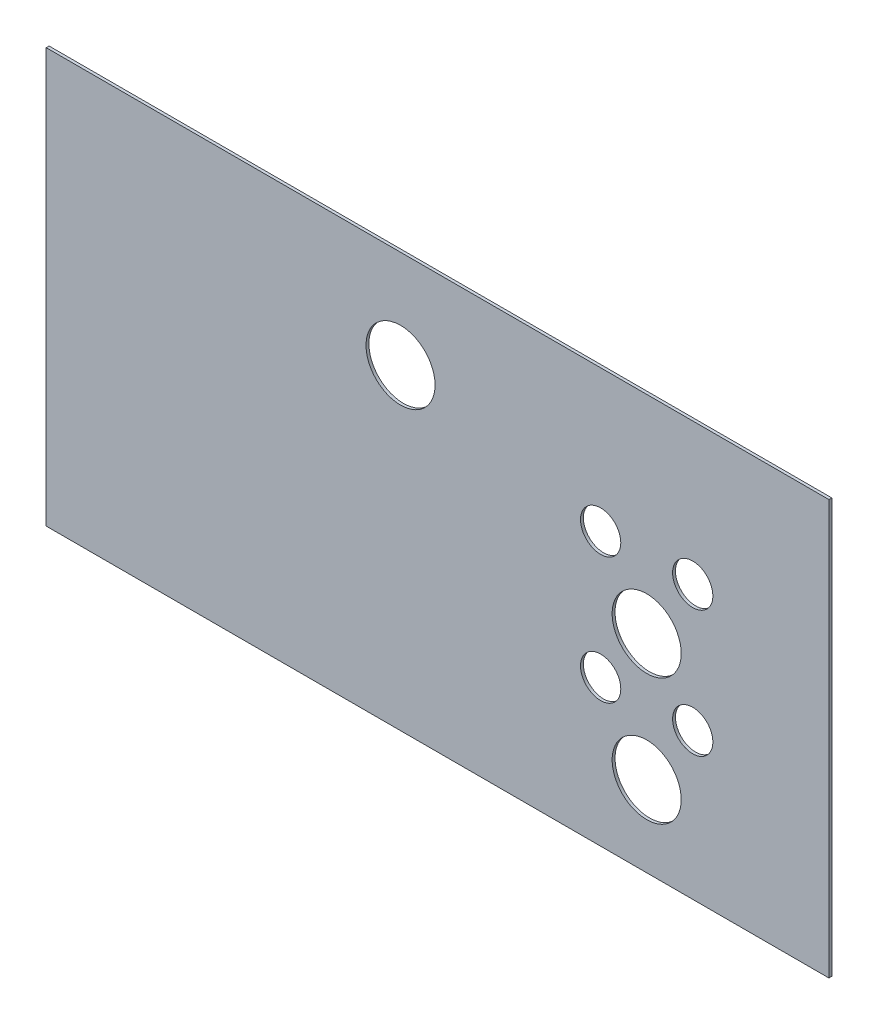
ISO-10303-21;
HEADER;
FILE_DESCRIPTION(('STEP AP214'),'2;1');
FILE_NAME('part.step','',(''),(''),'','','');
FILE_SCHEMA(('AUTOMOTIVE_DESIGN { 1 0 10303 214 1 1 1 1 }'));
ENDSEC;
DATA;
#1=APPLICATION_CONTEXT('core data for automotive mechanical design processes');
#2=APPLICATION_PROTOCOL_DEFINITION('international standard','automotive_design',2000,#1);
#3=PRODUCT_CONTEXT('',#1,'mechanical');
#4=PRODUCT('Part','Part','',(#3));
#5=PRODUCT_RELATED_PRODUCT_CATEGORY('part','',(#4));
#6=PRODUCT_DEFINITION_FORMATION('','',#4);
#7=PRODUCT_DEFINITION_CONTEXT('part definition',#1,'design');
#8=PRODUCT_DEFINITION('design','',#6,#7);
#9=PRODUCT_DEFINITION_SHAPE('','',#8);
#10=(LENGTH_UNIT() NAMED_UNIT(*) SI_UNIT(.MILLI.,.METRE.));
#11=(NAMED_UNIT(*) PLANE_ANGLE_UNIT() SI_UNIT($,.RADIAN.));
#12=(NAMED_UNIT(*) SI_UNIT($,.STERADIAN.) SOLID_ANGLE_UNIT());
#13=UNCERTAINTY_MEASURE_WITH_UNIT(LENGTH_MEASURE(1.E-05),#10,'distance_accuracy_value','');
#14=(GEOMETRIC_REPRESENTATION_CONTEXT(3) GLOBAL_UNCERTAINTY_ASSIGNED_CONTEXT((#13)) GLOBAL_UNIT_ASSIGNED_CONTEXT((#10,
#11,#12)) REPRESENTATION_CONTEXT('',''));
#15=CARTESIAN_POINT('',(0.,0.,0.));
#16=DIRECTION('',(0.,0.,1.));
#17=DIRECTION('',(1.,0.,0.));
#18=AXIS2_PLACEMENT_3D('',#15,#16,#17);
#19=CARTESIAN_POINT('',(-431.8,228.6,3.175));
#20=DIRECTION('',(1.,0.,0.));
#21=DIRECTION('',(0.,0.,-1.));
#22=AXIS2_PLACEMENT_3D('',#19,#20,#21);
#23=PLANE('',#22);
#24=DIRECTION('',(0.,-1.,0.));
#25=VECTOR('',#24,1.);
#26=CARTESIAN_POINT('',(-431.8,228.6,0.));
#27=LINE('',#26,#25);
#28=CARTESIAN_POINT('',(-431.8,228.6,0.));
#29=VERTEX_POINT('',#28);
#30=CARTESIAN_POINT('',(-431.8,-228.6,0.));
#31=VERTEX_POINT('',#30);
#32=EDGE_CURVE('E95',#29,#31,#27,.T.);
#33=ORIENTED_EDGE('',*,*,#32,.T.);
#34=DIRECTION('',(0.,0.,-1.));
#35=VECTOR('',#34,1.);
#36=CARTESIAN_POINT('',(-431.8,-228.6,3.175));
#37=LINE('',#36,#35);
#38=CARTESIAN_POINT('',(-431.8,-228.6,3.175));
#39=VERTEX_POINT('',#38);
#40=EDGE_CURVE('E11',#39,#31,#37,.T.);
#41=ORIENTED_EDGE('',*,*,#40,.F.);
#42=DIRECTION('',(0.,-1.,0.));
#43=VECTOR('',#42,1.);
#44=CARTESIAN_POINT('',(-431.8,228.6,3.175));
#45=LINE('',#44,#43);
#46=CARTESIAN_POINT('',(-431.8,228.6,3.175));
#47=VERTEX_POINT('',#46);
#48=EDGE_CURVE('E83',#47,#39,#45,.T.);
#49=ORIENTED_EDGE('',*,*,#48,.F.);
#50=DIRECTION('',(0.,0.,-1.));
#51=VECTOR('',#50,1.);
#52=CARTESIAN_POINT('',(-431.8,228.6,3.175));
#53=LINE('',#52,#51);
#54=EDGE_CURVE('E91',#47,#29,#53,.T.);
#55=ORIENTED_EDGE('',*,*,#54,.T.);
#56=EDGE_LOOP('',(#33,#41,#49,#55));
#57=FACE_BOUND('',#56,.T.);
#58=ADVANCED_FACE('F32',(#57),#23,.F.);
#59=CARTESIAN_POINT('',(-431.8,-228.6,3.175));
#60=DIRECTION('',(0.,1.,0.));
#61=DIRECTION('',(0.,0.,1.));
#62=AXIS2_PLACEMENT_3D('',#59,#60,#61);
#63=PLANE('',#62);
#64=DIRECTION('',(1.,0.,0.));
#65=VECTOR('',#64,1.);
#66=CARTESIAN_POINT('',(-431.8,-228.6,0.));
#67=LINE('',#66,#65);
#68=CARTESIAN_POINT('',(431.8,-228.6,0.));
#69=VERTEX_POINT('',#68);
#70=EDGE_CURVE('E87',#31,#69,#67,.T.);
#71=ORIENTED_EDGE('',*,*,#70,.T.);
#72=DIRECTION('',(0.,0.,-1.));
#73=VECTOR('',#72,1.);
#74=CARTESIAN_POINT('',(431.8,-228.6,3.175));
#75=LINE('',#74,#73);
#76=CARTESIAN_POINT('',(431.8,-228.6,3.175));
#77=VERTEX_POINT('',#76);
#78=EDGE_CURVE('E40',#77,#69,#75,.T.);
#79=ORIENTED_EDGE('',*,*,#78,.F.);
#80=DIRECTION('',(1.,0.,0.));
#81=VECTOR('',#80,1.);
#82=CARTESIAN_POINT('',(-431.8,-228.6,3.175));
#83=LINE('',#82,#81);
#84=EDGE_CURVE('E78',#39,#77,#83,.T.);
#85=ORIENTED_EDGE('',*,*,#84,.F.);
#86=ORIENTED_EDGE('',*,*,#40,.T.);
#87=EDGE_LOOP('',(#71,#79,#85,#86));
#88=FACE_BOUND('',#87,.T.);
#89=ADVANCED_FACE('F86',(#88),#63,.F.);
#90=CARTESIAN_POINT('',(431.8,228.6,3.175));
#91=DIRECTION('',(-1.,0.,0.));
#92=DIRECTION('',(0.,0.,1.));
#93=AXIS2_PLACEMENT_3D('',#90,#91,#92);
#94=PLANE('',#93);
#95=DIRECTION('',(0.,1.,0.));
#96=VECTOR('',#95,1.);
#97=CARTESIAN_POINT('',(431.8,228.6,0.));
#98=LINE('',#97,#96);
#99=CARTESIAN_POINT('',(431.8,228.6,0.));
#100=VERTEX_POINT('',#99);
#101=EDGE_CURVE('E65',#69,#100,#98,.T.);
#102=ORIENTED_EDGE('',*,*,#101,.T.);
#103=DIRECTION('',(0.,0.,-1.));
#104=VECTOR('',#103,1.);
#105=CARTESIAN_POINT('',(431.8,228.6,3.175));
#106=LINE('',#105,#104);
#107=CARTESIAN_POINT('',(431.8,228.6,3.175));
#108=VERTEX_POINT('',#107);
#109=EDGE_CURVE('E88',#108,#100,#106,.T.);
#110=ORIENTED_EDGE('',*,*,#109,.F.);
#111=DIRECTION('',(0.,1.,0.));
#112=VECTOR('',#111,1.);
#113=CARTESIAN_POINT('',(431.8,228.6,3.175));
#114=LINE('',#113,#112);
#115=EDGE_CURVE('E81',#77,#108,#114,.T.);
#116=ORIENTED_EDGE('',*,*,#115,.F.);
#117=ORIENTED_EDGE('',*,*,#78,.T.);
#118=EDGE_LOOP('',(#102,#110,#116,#117));
#119=FACE_BOUND('',#118,.T.);
#120=ADVANCED_FACE('F89',(#119),#94,.F.);
#121=CARTESIAN_POINT('',(-431.8,228.6,3.175));
#122=DIRECTION('',(0.,-1.,0.));
#123=DIRECTION('',(0.,0.,-1.));
#124=AXIS2_PLACEMENT_3D('',#121,#122,#123);
#125=PLANE('',#124);
#126=DIRECTION('',(-1.,0.,0.));
#127=VECTOR('',#126,1.);
#128=CARTESIAN_POINT('',(-431.8,228.6,0.));
#129=LINE('',#128,#127);
#130=EDGE_CURVE('E71',#100,#29,#129,.T.);
#131=ORIENTED_EDGE('',*,*,#130,.T.);
#132=ORIENTED_EDGE('',*,*,#54,.F.);
#133=DIRECTION('',(-1.,0.,0.));
#134=VECTOR('',#133,1.);
#135=CARTESIAN_POINT('',(-431.8,228.6,3.175));
#136=LINE('',#135,#134);
#137=EDGE_CURVE('E48',#108,#47,#136,.T.);
#138=ORIENTED_EDGE('',*,*,#137,.F.);
#139=ORIENTED_EDGE('',*,*,#109,.T.);
#140=EDGE_LOOP('',(#131,#132,#138,#139));
#141=FACE_BOUND('',#140,.T.);
#142=ADVANCED_FACE('F103',(#141),#125,.F.);
#143=CARTESIAN_POINT('',(0.,0.,3.175));
#144=DIRECTION('',(0.,0.,1.));
#145=DIRECTION('',(1.,0.,0.));
#146=AXIS2_PLACEMENT_3D('',#143,#144,#145);
#147=PLANE('',#146);
#148=CARTESIAN_POINT('',(230.7381000037,-139.7,3.175));
#149=DIRECTION('',(0.,0.,1.));
#150=DIRECTION('',(1.,0.,0.));
#151=AXIS2_PLACEMENT_3D('',#148,#149,#150);
#152=CIRCLE('',#151,38.1);
#153=CARTESIAN_POINT('',(268.8381000037,-139.7,3.175));
#154=VERTEX_POINT('',#153);
#155=EDGE_CURVE('E122',#154,#154,#152,.T.);
#156=ORIENTED_EDGE('',*,*,#155,.F.);
#157=EDGE_LOOP('',(#156));
#158=FACE_BOUND('',#157,.T.);
#159=CARTESIAN_POINT('',(-40.8558999878,120.65,3.175));
#160=DIRECTION('',(0.,0.,1.));
#161=DIRECTION('',(1.,0.,0.));
#162=AXIS2_PLACEMENT_3D('',#159,#160,#161);
#163=CIRCLE('',#162,38.1);
#164=CARTESIAN_POINT('',(-2.75589998779996,120.65,3.175));
#165=VERTEX_POINT('',#164);
#166=EDGE_CURVE('E135',#165,#165,#163,.T.);
#167=ORIENTED_EDGE('',*,*,#166,.F.);
#168=EDGE_LOOP('',(#167));
#169=FACE_BOUND('',#168,.T.);
#170=CARTESIAN_POINT('',(281.5381000037,72.4772000034,3.175));
#171=DIRECTION('',(0.,0.,1.));
#172=DIRECTION('',(1.,0.,0.));
#173=AXIS2_PLACEMENT_3D('',#170,#171,#172);
#174=CIRCLE('',#173,22.225);
#175=CARTESIAN_POINT('',(303.7631000037,72.4772000034,3.175));
#176=VERTEX_POINT('',#175);
#177=EDGE_CURVE('E141',#176,#176,#174,.T.);
#178=ORIENTED_EDGE('',*,*,#177,.F.);
#179=EDGE_LOOP('',(#178));
#180=FACE_BOUND('',#179,.T.);
#181=CARTESIAN_POINT('',(179.9381000037,-67.2227999966,3.175));
#182=DIRECTION('',(0.,0.,1.));
#183=DIRECTION('',(1.,0.,0.));
#184=AXIS2_PLACEMENT_3D('',#181,#182,#183);
#185=CIRCLE('',#184,22.225);
#186=CARTESIAN_POINT('',(202.1631000037,-67.2227999966,3.175));
#187=VERTEX_POINT('',#186);
#188=EDGE_CURVE('E116',#187,#187,#185,.T.);
#189=ORIENTED_EDGE('',*,*,#188,.F.);
#190=EDGE_LOOP('',(#189));
#191=FACE_BOUND('',#190,.T.);
#192=CARTESIAN_POINT('',(230.7381000037,0.,3.175));
#193=DIRECTION('',(0.,0.,1.));
#194=DIRECTION('',(1.,0.,0.));
#195=AXIS2_PLACEMENT_3D('',#192,#193,#194);
#196=CIRCLE('',#195,38.1);
#197=CARTESIAN_POINT('',(268.8381000037,0.,3.175));
#198=VERTEX_POINT('',#197);
#199=EDGE_CURVE('E109',#198,#198,#196,.T.);
#200=ORIENTED_EDGE('',*,*,#199,.F.);
#201=EDGE_LOOP('',(#200));
#202=FACE_BOUND('',#201,.T.);
#203=CARTESIAN_POINT('',(281.5381000037,-67.2227999966,3.175));
#204=DIRECTION('',(0.,0.,1.));
#205=DIRECTION('',(1.,0.,0.));
#206=AXIS2_PLACEMENT_3D('',#203,#204,#205);
#207=CIRCLE('',#206,22.225);
#208=CARTESIAN_POINT('',(303.7631000037,-67.2227999966,3.175));
#209=VERTEX_POINT('',#208);
#210=EDGE_CURVE('E130',#209,#209,#207,.T.);
#211=ORIENTED_EDGE('',*,*,#210,.F.);
#212=EDGE_LOOP('',(#211));
#213=FACE_BOUND('',#212,.T.);
#214=CARTESIAN_POINT('',(179.9381000037,72.4772000034,3.175));
#215=DIRECTION('',(0.,0.,1.));
#216=DIRECTION('',(1.,0.,0.));
#217=AXIS2_PLACEMENT_3D('',#214,#215,#216);
#218=CIRCLE('',#217,22.225);
#219=CARTESIAN_POINT('',(202.1631000037,72.4772000034,3.175));
#220=VERTEX_POINT('',#219);
#221=EDGE_CURVE('E123',#220,#220,#218,.T.);
#222=ORIENTED_EDGE('',*,*,#221,.F.);
#223=EDGE_LOOP('',(#222));
#224=FACE_BOUND('',#223,.T.);
#225=ORIENTED_EDGE('',*,*,#48,.T.);
#226=ORIENTED_EDGE('',*,*,#84,.T.);
#227=ORIENTED_EDGE('',*,*,#115,.T.);
#228=ORIENTED_EDGE('',*,*,#137,.T.);
#229=EDGE_LOOP('',(#225,#226,#227,#228));
#230=FACE_BOUND('',#229,.T.);
#231=ADVANCED_FACE('F79',(#158,#169,#180,#191,#202,#213,#224,#230),#147,.T.);
#232=CARTESIAN_POINT('',(0.,0.,0.));
#233=DIRECTION('',(0.,0.,1.));
#234=DIRECTION('',(1.,0.,0.));
#235=AXIS2_PLACEMENT_3D('',#232,#233,#234);
#236=PLANE('',#235);
#237=CARTESIAN_POINT('',(230.7381000037,-139.7,0.));
#238=DIRECTION('',(0.,0.,1.));
#239=DIRECTION('',(1.,0.,0.));
#240=AXIS2_PLACEMENT_3D('',#237,#238,#239);
#241=CIRCLE('',#240,38.1);
#242=CARTESIAN_POINT('',(268.8381000037,-139.7,0.));
#243=VERTEX_POINT('',#242);
#244=EDGE_CURVE('E98',#243,#243,#241,.T.);
#245=ORIENTED_EDGE('',*,*,#244,.T.);
#246=EDGE_LOOP('',(#245));
#247=FACE_BOUND('',#246,.T.);
#248=CARTESIAN_POINT('',(-40.8558999878,120.65,0.));
#249=DIRECTION('',(0.,0.,1.));
#250=DIRECTION('',(1.,0.,0.));
#251=AXIS2_PLACEMENT_3D('',#248,#249,#250);
#252=CIRCLE('',#251,38.1);
#253=CARTESIAN_POINT('',(-2.75589998779996,120.65,0.));
#254=VERTEX_POINT('',#253);
#255=EDGE_CURVE('E138',#254,#254,#252,.T.);
#256=ORIENTED_EDGE('',*,*,#255,.T.);
#257=EDGE_LOOP('',(#256));
#258=FACE_BOUND('',#257,.T.);
#259=CARTESIAN_POINT('',(281.5381000037,72.4772000034,0.));
#260=DIRECTION('',(0.,0.,1.));
#261=DIRECTION('',(1.,0.,0.));
#262=AXIS2_PLACEMENT_3D('',#259,#260,#261);
#263=CIRCLE('',#262,22.225);
#264=CARTESIAN_POINT('',(303.7631000037,72.4772000034,0.));
#265=VERTEX_POINT('',#264);
#266=EDGE_CURVE('E127',#265,#265,#263,.T.);
#267=ORIENTED_EDGE('',*,*,#266,.T.);
#268=EDGE_LOOP('',(#267));
#269=FACE_BOUND('',#268,.T.);
#270=CARTESIAN_POINT('',(179.9381000037,-67.2227999966,0.));
#271=DIRECTION('',(0.,0.,1.));
#272=DIRECTION('',(1.,0.,0.));
#273=AXIS2_PLACEMENT_3D('',#270,#271,#272);
#274=CIRCLE('',#273,22.225);
#275=CARTESIAN_POINT('',(202.1631000037,-67.2227999966,0.));
#276=VERTEX_POINT('',#275);
#277=EDGE_CURVE('E119',#276,#276,#274,.T.);
#278=ORIENTED_EDGE('',*,*,#277,.T.);
#279=EDGE_LOOP('',(#278));
#280=FACE_BOUND('',#279,.T.);
#281=CARTESIAN_POINT('',(230.7381000037,0.,0.));
#282=DIRECTION('',(0.,0.,1.));
#283=DIRECTION('',(1.,0.,0.));
#284=AXIS2_PLACEMENT_3D('',#281,#282,#283);
#285=CIRCLE('',#284,38.1);
#286=CARTESIAN_POINT('',(268.8381000037,0.,0.));
#287=VERTEX_POINT('',#286);
#288=EDGE_CURVE('E112',#287,#287,#285,.T.);
#289=ORIENTED_EDGE('',*,*,#288,.T.);
#290=EDGE_LOOP('',(#289));
#291=FACE_BOUND('',#290,.T.);
#292=CARTESIAN_POINT('',(281.5381000037,-67.2227999966,0.));
#293=DIRECTION('',(0.,0.,1.));
#294=DIRECTION('',(1.,0.,0.));
#295=AXIS2_PLACEMENT_3D('',#292,#293,#294);
#296=CIRCLE('',#295,22.225);
#297=CARTESIAN_POINT('',(303.7631000037,-67.2227999966,0.));
#298=VERTEX_POINT('',#297);
#299=EDGE_CURVE('E113',#298,#298,#296,.T.);
#300=ORIENTED_EDGE('',*,*,#299,.T.);
#301=EDGE_LOOP('',(#300));
#302=FACE_BOUND('',#301,.T.);
#303=CARTESIAN_POINT('',(179.9381000037,72.4772000034,0.));
#304=DIRECTION('',(0.,0.,1.));
#305=DIRECTION('',(1.,0.,0.));
#306=AXIS2_PLACEMENT_3D('',#303,#304,#305);
#307=CIRCLE('',#306,22.225);
#308=CARTESIAN_POINT('',(202.1631000037,72.4772000034,0.));
#309=VERTEX_POINT('',#308);
#310=EDGE_CURVE('E126',#309,#309,#307,.T.);
#311=ORIENTED_EDGE('',*,*,#310,.T.);
#312=EDGE_LOOP('',(#311));
#313=FACE_BOUND('',#312,.T.);
#314=ORIENTED_EDGE('',*,*,#32,.F.);
#315=ORIENTED_EDGE('',*,*,#130,.F.);
#316=ORIENTED_EDGE('',*,*,#101,.F.);
#317=ORIENTED_EDGE('',*,*,#70,.F.);
#318=EDGE_LOOP('',(#314,#315,#316,#317));
#319=FACE_BOUND('',#318,.T.);
#320=ADVANCED_FACE('F106',(#247,#258,#269,#280,#291,#302,#313,#319),#236,.F.);
#321=CARTESIAN_POINT('',(179.9381000037,72.4772000034,0.));
#322=DIRECTION('',(0.,0.,1.));
#323=DIRECTION('',(1.,0.,0.));
#324=AXIS2_PLACEMENT_3D('',#321,#322,#323);
#325=CYLINDRICAL_SURFACE('',#324,22.225);
#326=ORIENTED_EDGE('',*,*,#310,.F.);
#327=EDGE_LOOP('',(#326));
#328=FACE_BOUND('',#327,.T.);
#329=ORIENTED_EDGE('',*,*,#221,.T.);
#330=EDGE_LOOP('',(#329));
#331=FACE_BOUND('',#330,.T.);
#332=ADVANCED_FACE('F175',(#328,#331),#325,.F.);
#333=CARTESIAN_POINT('',(281.5381000037,-67.2227999966,0.));
#334=DIRECTION('',(0.,0.,1.));
#335=DIRECTION('',(1.,0.,0.));
#336=AXIS2_PLACEMENT_3D('',#333,#334,#335);
#337=CYLINDRICAL_SURFACE('',#336,22.225);
#338=ORIENTED_EDGE('',*,*,#299,.F.);
#339=EDGE_LOOP('',(#338));
#340=FACE_BOUND('',#339,.T.);
#341=ORIENTED_EDGE('',*,*,#210,.T.);
#342=EDGE_LOOP('',(#341));
#343=FACE_BOUND('',#342,.T.);
#344=ADVANCED_FACE('F177',(#340,#343),#337,.F.);
#345=CARTESIAN_POINT('',(230.7381000037,0.,0.));
#346=DIRECTION('',(0.,0.,1.));
#347=DIRECTION('',(1.,0.,0.));
#348=AXIS2_PLACEMENT_3D('',#345,#346,#347);
#349=CYLINDRICAL_SURFACE('',#348,38.1);
#350=ORIENTED_EDGE('',*,*,#288,.F.);
#351=EDGE_LOOP('',(#350));
#352=FACE_BOUND('',#351,.T.);
#353=ORIENTED_EDGE('',*,*,#199,.T.);
#354=EDGE_LOOP('',(#353));
#355=FACE_BOUND('',#354,.T.);
#356=ADVANCED_FACE('F184',(#352,#355),#349,.F.);
#357=CARTESIAN_POINT('',(179.9381000037,-67.2227999966,0.));
#358=DIRECTION('',(0.,0.,1.));
#359=DIRECTION('',(1.,0.,0.));
#360=AXIS2_PLACEMENT_3D('',#357,#358,#359);
#361=CYLINDRICAL_SURFACE('',#360,22.225);
#362=ORIENTED_EDGE('',*,*,#277,.F.);
#363=EDGE_LOOP('',(#362));
#364=FACE_BOUND('',#363,.T.);
#365=ORIENTED_EDGE('',*,*,#188,.T.);
#366=EDGE_LOOP('',(#365));
#367=FACE_BOUND('',#366,.T.);
#368=ADVANCED_FACE('F202',(#364,#367),#361,.F.);
#369=CARTESIAN_POINT('',(281.5381000037,72.4772000034,0.));
#370=DIRECTION('',(0.,0.,1.));
#371=DIRECTION('',(1.,0.,0.));
#372=AXIS2_PLACEMENT_3D('',#369,#370,#371);
#373=CYLINDRICAL_SURFACE('',#372,22.225);
#374=ORIENTED_EDGE('',*,*,#266,.F.);
#375=EDGE_LOOP('',(#374));
#376=FACE_BOUND('',#375,.T.);
#377=ORIENTED_EDGE('',*,*,#177,.T.);
#378=EDGE_LOOP('',(#377));
#379=FACE_BOUND('',#378,.T.);
#380=ADVANCED_FACE('F205',(#376,#379),#373,.F.);
#381=CARTESIAN_POINT('',(-40.8558999878,120.65,0.));
#382=DIRECTION('',(0.,0.,1.));
#383=DIRECTION('',(1.,0.,0.));
#384=AXIS2_PLACEMENT_3D('',#381,#382,#383);
#385=CYLINDRICAL_SURFACE('',#384,38.1);
#386=ORIENTED_EDGE('',*,*,#255,.F.);
#387=EDGE_LOOP('',(#386));
#388=FACE_BOUND('',#387,.T.);
#389=ORIENTED_EDGE('',*,*,#166,.T.);
#390=EDGE_LOOP('',(#389));
#391=FACE_BOUND('',#390,.T.);
#392=ADVANCED_FACE('F156',(#388,#391),#385,.F.);
#393=CARTESIAN_POINT('',(230.7381000037,-139.7,0.));
#394=DIRECTION('',(0.,0.,1.));
#395=DIRECTION('',(1.,0.,0.));
#396=AXIS2_PLACEMENT_3D('',#393,#394,#395);
#397=CYLINDRICAL_SURFACE('',#396,38.1);
#398=ORIENTED_EDGE('',*,*,#244,.F.);
#399=EDGE_LOOP('',(#398));
#400=FACE_BOUND('',#399,.T.);
#401=ORIENTED_EDGE('',*,*,#155,.T.);
#402=EDGE_LOOP('',(#401));
#403=FACE_BOUND('',#402,.T.);
#404=ADVANCED_FACE('F153',(#400,#403),#397,.F.);
#405=CLOSED_SHELL('',(#58,#89,#120,#142,#231,#320,#332,#344,#356,#368,#380,#392,#404));
#406=MANIFOLD_SOLID_BREP('B2',#405);
#407=ADVANCED_BREP_SHAPE_REPRESENTATION('',(#18,#406),#14);
#408=SHAPE_DEFINITION_REPRESENTATION(#9,#407);
ENDSEC;
END-ISO-10303-21;
